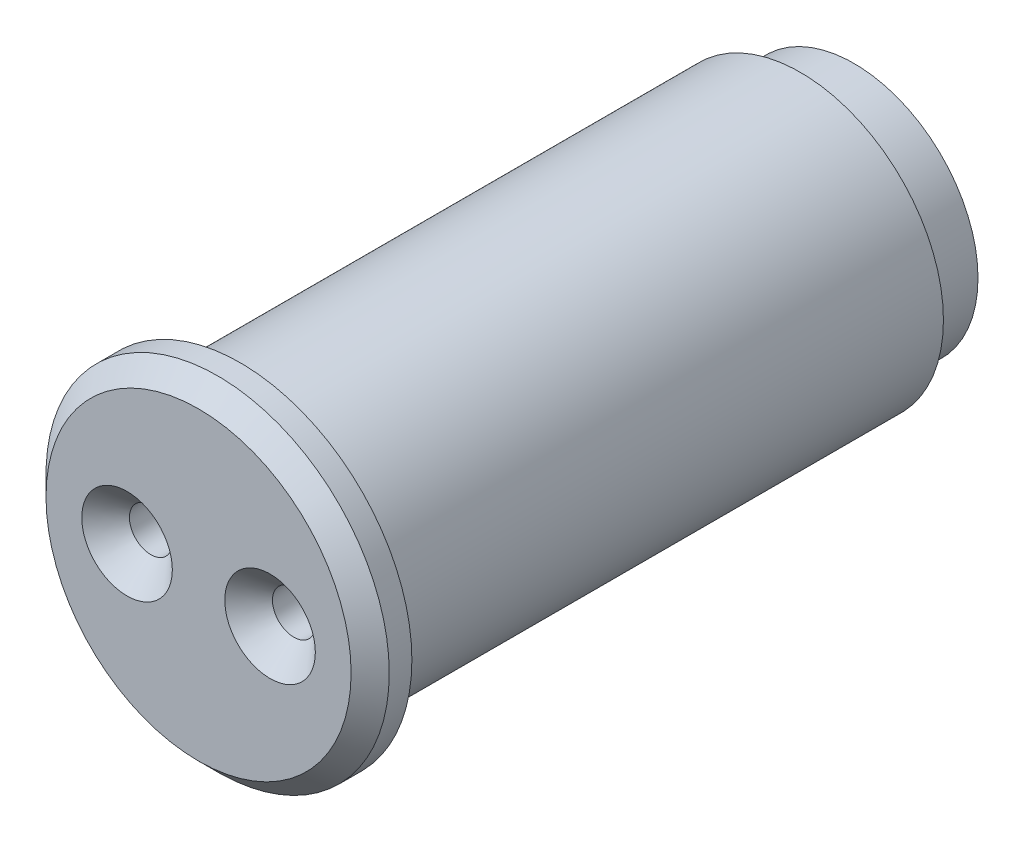
ISO-10303-21;
HEADER;
FILE_DESCRIPTION(('STEP AP214'),'2;1');
FILE_NAME('part.step','',(''),(''),'','','');
FILE_SCHEMA(('AUTOMOTIVE_DESIGN { 1 0 10303 214 1 1 1 1 }'));
ENDSEC;
DATA;
#1=APPLICATION_CONTEXT('core data for automotive mechanical design processes');
#2=APPLICATION_PROTOCOL_DEFINITION('international standard','automotive_design',2000,#1);
#3=PRODUCT_CONTEXT('',#1,'mechanical');
#4=PRODUCT('Part','Part','',(#3));
#5=PRODUCT_RELATED_PRODUCT_CATEGORY('part','',(#4));
#6=PRODUCT_DEFINITION_FORMATION('','',#4);
#7=PRODUCT_DEFINITION_CONTEXT('part definition',#1,'design');
#8=PRODUCT_DEFINITION('design','',#6,#7);
#9=PRODUCT_DEFINITION_SHAPE('','',#8);
#10=(LENGTH_UNIT() NAMED_UNIT(*) SI_UNIT(.MILLI.,.METRE.));
#11=(NAMED_UNIT(*) PLANE_ANGLE_UNIT() SI_UNIT($,.RADIAN.));
#12=(NAMED_UNIT(*) SI_UNIT($,.STERADIAN.) SOLID_ANGLE_UNIT());
#13=UNCERTAINTY_MEASURE_WITH_UNIT(LENGTH_MEASURE(1.E-05),#10,'distance_accuracy_value','');
#14=(GEOMETRIC_REPRESENTATION_CONTEXT(3) GLOBAL_UNCERTAINTY_ASSIGNED_CONTEXT((#13)) GLOBAL_UNIT_ASSIGNED_CONTEXT((#10,
#11,#12)) REPRESENTATION_CONTEXT('',''));
#15=CARTESIAN_POINT('',(0.,0.,0.));
#16=DIRECTION('',(0.,0.,1.));
#17=DIRECTION('',(1.,0.,0.));
#18=AXIS2_PLACEMENT_3D('',#15,#16,#17);
#19=CARTESIAN_POINT('',(0.,0.,25.75));
#20=DIRECTION('',(0.,0.,1.));
#21=DIRECTION('',(1.,0.,0.));
#22=AXIS2_PLACEMENT_3D('',#19,#20,#21);
#23=CYLINDRICAL_SURFACE('',#22,7.2);
#24=CARTESIAN_POINT('',(0.,0.,26.7));
#25=DIRECTION('',(0.,0.,1.));
#26=DIRECTION('',(1.,0.,0.));
#27=AXIS2_PLACEMENT_3D('',#24,#25,#26);
#28=CIRCLE('',#27,7.2);
#29=CARTESIAN_POINT('',(7.2,0.,26.7));
#30=VERTEX_POINT('',#29);
#31=EDGE_CURVE('E10',#30,#30,#28,.F.);
#32=ORIENTED_EDGE('',*,*,#31,.T.);
#33=EDGE_LOOP('',(#32));
#34=FACE_BOUND('',#33,.T.);
#35=CARTESIAN_POINT('',(0.,0.,25.75));
#36=DIRECTION('',(0.,0.,1.));
#37=DIRECTION('',(1.,0.,0.));
#38=AXIS2_PLACEMENT_3D('',#35,#36,#37);
#39=CIRCLE('',#38,7.2);
#40=CARTESIAN_POINT('',(7.2,0.,25.75));
#41=VERTEX_POINT('',#40);
#42=EDGE_CURVE('E76',#41,#41,#39,.T.);
#43=ORIENTED_EDGE('',*,*,#42,.T.);
#44=EDGE_LOOP('',(#43));
#45=FACE_BOUND('',#44,.T.);
#46=ADVANCED_FACE('F33',(#34,#45),#23,.T.);
#47=CARTESIAN_POINT('',(0.,0.,25.75));
#48=DIRECTION('',(0.,0.,1.));
#49=DIRECTION('',(1.,0.,0.));
#50=AXIS2_PLACEMENT_3D('',#47,#48,#49);
#51=PLANE('',#50);
#52=CARTESIAN_POINT('',(0.,0.,25.75));
#53=DIRECTION('',(0.,0.,1.));
#54=DIRECTION('',(1.,0.,0.));
#55=AXIS2_PLACEMENT_3D('',#52,#53,#54);
#56=CIRCLE('',#55,6.);
#57=CARTESIAN_POINT('',(6.,0.,25.75));
#58=VERTEX_POINT('',#57);
#59=EDGE_CURVE('E72',#58,#58,#56,.F.);
#60=ORIENTED_EDGE('',*,*,#59,.F.);
#61=EDGE_LOOP('',(#60));
#62=FACE_BOUND('',#61,.T.);
#63=ORIENTED_EDGE('',*,*,#42,.F.);
#64=EDGE_LOOP('',(#63));
#65=FACE_BOUND('',#64,.T.);
#66=ADVANCED_FACE('F160',(#62,#65),#51,.F.);
#67=CARTESIAN_POINT('',(0.,0.,27.5));
#68=DIRECTION('',(0.,0.,1.));
#69=DIRECTION('',(1.,0.,0.));
#70=AXIS2_PLACEMENT_3D('',#67,#68,#69);
#71=PLANE('',#70);
#72=CARTESIAN_POINT('',(0.,0.,27.5));
#73=DIRECTION('',(0.,0.,1.));
#74=DIRECTION('',(1.,0.,0.));
#75=AXIS2_PLACEMENT_3D('',#72,#73,#74);
#76=CIRCLE('',#75,6.4);
#77=CARTESIAN_POINT('',(6.4,0.,27.5));
#78=VERTEX_POINT('',#77);
#79=EDGE_CURVE('E41',#78,#78,#76,.T.);
#80=ORIENTED_EDGE('',*,*,#79,.T.);
#81=EDGE_LOOP('',(#80));
#82=FACE_BOUND('',#81,.T.);
#83=CARTESIAN_POINT('',(-3.,0.,27.5));
#84=DIRECTION('',(0.,0.,1.));
#85=DIRECTION('',(1.,0.,0.));
#86=AXIS2_PLACEMENT_3D('',#83,#84,#85);
#87=CIRCLE('',#86,1.90000000000001);
#88=CARTESIAN_POINT('',(-1.09999999999999,0.,27.5));
#89=VERTEX_POINT('',#88);
#90=EDGE_CURVE('E49',#89,#89,#87,.F.);
#91=ORIENTED_EDGE('',*,*,#90,.T.);
#92=EDGE_LOOP('',(#91));
#93=FACE_BOUND('',#92,.T.);
#94=CARTESIAN_POINT('',(3.00000000000015,-1.15126107200936E-13,27.5));
#95=DIRECTION('',(0.,0.,1.));
#96=DIRECTION('',(1.,0.,0.));
#97=AXIS2_PLACEMENT_3D('',#94,#95,#96);
#98=CIRCLE('',#97,1.90000000000001);
#99=CARTESIAN_POINT('',(4.90000000000016,-1.15126107200936E-13,27.5));
#100=VERTEX_POINT('',#99);
#101=EDGE_CURVE('E54',#100,#100,#98,.F.);
#102=ORIENTED_EDGE('',*,*,#101,.T.);
#103=EDGE_LOOP('',(#102));
#104=FACE_BOUND('',#103,.T.);
#105=ADVANCED_FACE('F167',(#82,#93,#104),#71,.T.);
#106=CARTESIAN_POINT('',(0.,0.,2.25));
#107=DIRECTION('',(0.,0.,1.));
#108=DIRECTION('',(1.,0.,0.));
#109=AXIS2_PLACEMENT_3D('',#106,#107,#108);
#110=CYLINDRICAL_SURFACE('',#109,6.);
#111=CARTESIAN_POINT('',(0.,0.,2.25));
#112=DIRECTION('',(0.,0.,-1.));
#113=DIRECTION('',(-1.,0.,0.));
#114=AXIS2_PLACEMENT_3D('',#111,#112,#113);
#115=CIRCLE('',#114,6.);
#116=CARTESIAN_POINT('',(-6.,0.,2.25));
#117=VERTEX_POINT('',#116);
#118=EDGE_CURVE('E77',#117,#117,#115,.T.);
#119=ORIENTED_EDGE('',*,*,#118,.F.);
#120=EDGE_LOOP('',(#119));
#121=FACE_BOUND('',#120,.T.);
#122=ORIENTED_EDGE('',*,*,#59,.T.);
#123=EDGE_LOOP('',(#122));
#124=FACE_BOUND('',#123,.T.);
#125=ADVANCED_FACE('F173',(#121,#124),#110,.T.);
#126=CARTESIAN_POINT('',(0.,0.,2.25));
#127=DIRECTION('',(0.,0.,-1.));
#128=DIRECTION('',(-1.,0.,0.));
#129=AXIS2_PLACEMENT_3D('',#126,#127,#128);
#130=PLANE('',#129);
#131=CARTESIAN_POINT('',(0.,0.,2.25));
#132=DIRECTION('',(0.,0.,-1.));
#133=DIRECTION('',(-1.,0.,0.));
#134=AXIS2_PLACEMENT_3D('',#131,#132,#133);
#135=CIRCLE('',#134,5.2);
#136=CARTESIAN_POINT('',(-5.2,0.,2.25));
#137=VERTEX_POINT('',#136);
#138=EDGE_CURVE('E73',#137,#137,#135,.T.);
#139=ORIENTED_EDGE('',*,*,#138,.F.);
#140=EDGE_LOOP('',(#139));
#141=FACE_BOUND('',#140,.T.);
#142=ORIENTED_EDGE('',*,*,#118,.T.);
#143=EDGE_LOOP('',(#142));
#144=FACE_BOUND('',#143,.T.);
#145=ADVANCED_FACE('F137',(#141,#144),#130,.T.);
#146=CARTESIAN_POINT('',(0.,0.,0.));
#147=DIRECTION('',(0.,0.,1.));
#148=DIRECTION('',(1.,0.,0.));
#149=AXIS2_PLACEMENT_3D('',#146,#147,#148);
#150=PLANE('',#149);
#151=CARTESIAN_POINT('',(1.52974878935158,-2.98925118494392,0.));
#152=DIRECTION('',(0.,0.,-1.));
#153=DIRECTION('',(1.,0.,0.));
#154=AXIS2_PLACEMENT_3D('',#151,#152,#153);
#155=CIRCLE('',#154,0.493863848590537);
#156=CARTESIAN_POINT('',(2.02361263794211,-2.98925118494392,0.));
#157=VERTEX_POINT('',#156);
#158=EDGE_CURVE('E106',#157,#157,#155,.T.);
#159=ORIENTED_EDGE('',*,*,#158,.F.);
#160=EDGE_LOOP('',(#159));
#161=FACE_BOUND('',#160,.T.);
#162=CARTESIAN_POINT('',(-1.60059752869924,-2.95192167178147,0.));
#163=DIRECTION('',(0.,0.,-1.));
#164=DIRECTION('',(-1.,0.,0.));
#165=AXIS2_PLACEMENT_3D('',#162,#163,#164);
#166=CIRCLE('',#165,0.493863848590537);
#167=CARTESIAN_POINT('',(-2.09446137728978,-2.95192167178147,0.));
#168=VERTEX_POINT('',#167);
#169=EDGE_CURVE('E112',#168,#168,#166,.T.);
#170=ORIENTED_EDGE('',*,*,#169,.F.);
#171=EDGE_LOOP('',(#170));
#172=FACE_BOUND('',#171,.T.);
#173=CARTESIAN_POINT('',(-1.52974878935158,2.98925118494392,0.));
#174=DIRECTION('',(0.,0.,-1.));
#175=DIRECTION('',(1.,0.,0.));
#176=AXIS2_PLACEMENT_3D('',#173,#174,#175);
#177=CIRCLE('',#176,0.493863848590537);
#178=CARTESIAN_POINT('',(-1.03588494076104,2.98925118494392,0.));
#179=VERTEX_POINT('',#178);
#180=EDGE_CURVE('E118',#179,#179,#177,.T.);
#181=ORIENTED_EDGE('',*,*,#180,.F.);
#182=EDGE_LOOP('',(#181));
#183=FACE_BOUND('',#182,.T.);
#184=CARTESIAN_POINT('',(1.60059752869924,2.95192167178147,0.));
#185=DIRECTION('',(0.,0.,-1.));
#186=DIRECTION('',(-1.,0.,0.));
#187=AXIS2_PLACEMENT_3D('',#184,#185,#186);
#188=CIRCLE('',#187,0.493863848590537);
#189=CARTESIAN_POINT('',(1.1067336801087,2.95192167178147,0.));
#190=VERTEX_POINT('',#189);
#191=EDGE_CURVE('E100',#190,#190,#188,.T.);
#192=ORIENTED_EDGE('',*,*,#191,.F.);
#193=EDGE_LOOP('',(#192));
#194=FACE_BOUND('',#193,.T.);
#195=CARTESIAN_POINT('',(-3.,0.,0.));
#196=DIRECTION('',(0.,0.,1.));
#197=DIRECTION('',(1.,0.,0.));
#198=AXIS2_PLACEMENT_3D('',#195,#196,#197);
#199=CIRCLE('',#198,1.85);
#200=CARTESIAN_POINT('',(-1.15,0.,0.));
#201=VERTEX_POINT('',#200);
#202=EDGE_CURVE('E66',#201,#201,#199,.T.);
#203=ORIENTED_EDGE('',*,*,#202,.T.);
#204=EDGE_LOOP('',(#203));
#205=FACE_BOUND('',#204,.T.);
#206=CARTESIAN_POINT('',(3.00000000000015,-1.15126107200936E-13,0.));
#207=DIRECTION('',(0.,0.,1.));
#208=DIRECTION('',(1.,0.,0.));
#209=AXIS2_PLACEMENT_3D('',#206,#207,#208);
#210=CIRCLE('',#209,1.85);
#211=CARTESIAN_POINT('',(4.85000000000015,-1.15126107200936E-13,0.));
#212=VERTEX_POINT('',#211);
#213=EDGE_CURVE('E69',#212,#212,#210,.T.);
#214=ORIENTED_EDGE('',*,*,#213,.T.);
#215=EDGE_LOOP('',(#214));
#216=FACE_BOUND('',#215,.T.);
#217=CARTESIAN_POINT('',(0.,0.,0.));
#218=DIRECTION('',(0.,0.,1.));
#219=DIRECTION('',(1.,0.,0.));
#220=AXIS2_PLACEMENT_3D('',#217,#218,#219);
#221=CIRCLE('',#220,5.2);
#222=CARTESIAN_POINT('',(5.2,0.,0.));
#223=VERTEX_POINT('',#222);
#224=EDGE_CURVE('E80',#223,#223,#221,.T.);
#225=ORIENTED_EDGE('',*,*,#224,.F.);
#226=EDGE_LOOP('',(#225));
#227=FACE_BOUND('',#226,.T.);
#228=ADVANCED_FACE('F133',(#161,#172,#183,#194,#205,#216,#227),#150,.F.);
#229=CARTESIAN_POINT('',(0.,0.,27.5));
#230=DIRECTION('',(0.,0.,-1.));
#231=DIRECTION('',(-1.,0.,0.));
#232=AXIS2_PLACEMENT_3D('',#229,#230,#231);
#233=CYLINDRICAL_SURFACE('',#232,5.2);
#234=ORIENTED_EDGE('',*,*,#138,.T.);
#235=EDGE_LOOP('',(#234));
#236=FACE_BOUND('',#235,.T.);
#237=ORIENTED_EDGE('',*,*,#224,.T.);
#238=EDGE_LOOP('',(#237));
#239=FACE_BOUND('',#238,.T.);
#240=ADVANCED_FACE('F136',(#236,#239),#233,.T.);
#241=CARTESIAN_POINT('',(3.00000000000015,-1.15126107200936E-13,8.));
#242=DIRECTION('',(0.,0.,-1.));
#243=DIRECTION('',(-1.,0.,0.));
#244=AXIS2_PLACEMENT_3D('',#241,#242,#243);
#245=CYLINDRICAL_SURFACE('',#244,0.85);
#246=CARTESIAN_POINT('',(3.00000000000015,-1.15126107200936E-13,1.));
#247=DIRECTION('',(0.,0.,1.));
#248=DIRECTION('',(1.,0.,0.));
#249=AXIS2_PLACEMENT_3D('',#246,#247,#248);
#250=CIRCLE('',#249,0.85);
#251=CARTESIAN_POINT('',(3.85000000000015,-1.15126107200936E-13,1.));
#252=VERTEX_POINT('',#251);
#253=EDGE_CURVE('E60',#252,#252,#250,.F.);
#254=ORIENTED_EDGE('',*,*,#253,.T.);
#255=EDGE_LOOP('',(#254));
#256=FACE_BOUND('',#255,.T.);
#257=CARTESIAN_POINT('',(3.00000000000015,-1.15126107200936E-13,8.));
#258=DIRECTION('',(0.,0.,1.));
#259=DIRECTION('',(1.,0.,0.));
#260=AXIS2_PLACEMENT_3D('',#257,#258,#259);
#261=CIRCLE('',#260,0.85);
#262=CARTESIAN_POINT('',(3.85000000000015,-1.15126107200936E-13,8.));
#263=VERTEX_POINT('',#262);
#264=EDGE_CURVE('E88',#263,#263,#261,.T.);
#265=ORIENTED_EDGE('',*,*,#264,.T.);
#266=EDGE_LOOP('',(#265));
#267=FACE_BOUND('',#266,.T.);
#268=ADVANCED_FACE('F149',(#256,#267),#245,.F.);
#269=CARTESIAN_POINT('',(3.00000000000015,-1.15126107200936E-13,8.));
#270=DIRECTION('',(0.,0.,-1.));
#271=DIRECTION('',(1.,0.,0.));
#272=AXIS2_PLACEMENT_3D('',#269,#270,#271);
#273=PLANE('',#272);
#274=ORIENTED_EDGE('',*,*,#264,.F.);
#275=EDGE_LOOP('',(#274));
#276=FACE_BOUND('',#275,.T.);
#277=ADVANCED_FACE('F155',(#276),#273,.T.);
#278=CARTESIAN_POINT('',(-3.,0.,8.));
#279=DIRECTION('',(0.,0.,-1.));
#280=DIRECTION('',(-1.,0.,0.));
#281=AXIS2_PLACEMENT_3D('',#278,#279,#280);
#282=CYLINDRICAL_SURFACE('',#281,0.85);
#283=CARTESIAN_POINT('',(-3.,0.,1.));
#284=DIRECTION('',(0.,0.,1.));
#285=DIRECTION('',(1.,0.,0.));
#286=AXIS2_PLACEMENT_3D('',#283,#284,#285);
#287=CIRCLE('',#286,0.85);
#288=CARTESIAN_POINT('',(-2.15,0.,1.));
#289=VERTEX_POINT('',#288);
#290=EDGE_CURVE('E63',#289,#289,#287,.F.);
#291=ORIENTED_EDGE('',*,*,#290,.T.);
#292=EDGE_LOOP('',(#291));
#293=FACE_BOUND('',#292,.T.);
#294=CARTESIAN_POINT('',(-3.,0.,8.));
#295=DIRECTION('',(0.,0.,1.));
#296=DIRECTION('',(1.,0.,0.));
#297=AXIS2_PLACEMENT_3D('',#294,#295,#296);
#298=CIRCLE('',#297,0.85);
#299=CARTESIAN_POINT('',(-2.15,0.,8.));
#300=VERTEX_POINT('',#299);
#301=EDGE_CURVE('E87',#300,#300,#298,.T.);
#302=ORIENTED_EDGE('',*,*,#301,.T.);
#303=EDGE_LOOP('',(#302));
#304=FACE_BOUND('',#303,.T.);
#305=ADVANCED_FACE('F325',(#293,#304),#282,.F.);
#306=CARTESIAN_POINT('',(-3.,0.,8.));
#307=DIRECTION('',(0.,0.,-1.));
#308=DIRECTION('',(1.,0.,0.));
#309=AXIS2_PLACEMENT_3D('',#306,#307,#308);
#310=PLANE('',#309);
#311=ORIENTED_EDGE('',*,*,#301,.F.);
#312=EDGE_LOOP('',(#311));
#313=FACE_BOUND('',#312,.T.);
#314=ADVANCED_FACE('F320',(#313),#310,.T.);
#315=CARTESIAN_POINT('',(-3.,0.,16.9544155877284));
#316=DIRECTION('',(0.,0.,1.));
#317=DIRECTION('',(1.,0.,0.));
#318=AXIS2_PLACEMENT_3D('',#315,#316,#317);
#319=CYLINDRICAL_SURFACE('',#318,0.9);
#320=CARTESIAN_POINT('',(-3.,0.,26.5));
#321=DIRECTION('',(0.,0.,1.));
#322=DIRECTION('',(1.,0.,0.));
#323=AXIS2_PLACEMENT_3D('',#320,#321,#322);
#324=CIRCLE('',#323,0.9);
#325=CARTESIAN_POINT('',(-2.1,0.,26.5));
#326=VERTEX_POINT('',#325);
#327=EDGE_CURVE('E57',#326,#326,#324,.T.);
#328=ORIENTED_EDGE('',*,*,#327,.T.);
#329=EDGE_LOOP('',(#328));
#330=FACE_BOUND('',#329,.T.);
#331=CARTESIAN_POINT('',(-3.,0.,19.5));
#332=DIRECTION('',(0.,0.,1.));
#333=DIRECTION('',(1.,0.,0.));
#334=AXIS2_PLACEMENT_3D('',#331,#332,#333);
#335=CIRCLE('',#334,0.9);
#336=CARTESIAN_POINT('',(-2.1,0.,19.5));
#337=VERTEX_POINT('',#336);
#338=EDGE_CURVE('E91',#337,#337,#335,.F.);
#339=ORIENTED_EDGE('',*,*,#338,.T.);
#340=EDGE_LOOP('',(#339));
#341=FACE_BOUND('',#340,.T.);
#342=ADVANCED_FACE('F195',(#330,#341),#319,.F.);
#343=CARTESIAN_POINT('',(3.00000000000015,-1.15126107200936E-13,16.9544155877284));
#344=DIRECTION('',(0.,0.,1.));
#345=DIRECTION('',(1.,0.,0.));
#346=AXIS2_PLACEMENT_3D('',#343,#344,#345);
#347=CYLINDRICAL_SURFACE('',#346,0.9);
#348=CARTESIAN_POINT('',(3.00000000000015,-1.15126107200936E-13,26.5));
#349=DIRECTION('',(0.,0.,1.));
#350=DIRECTION('',(1.,0.,0.));
#351=AXIS2_PLACEMENT_3D('',#348,#349,#350);
#352=CIRCLE('',#351,0.9);
#353=CARTESIAN_POINT('',(3.90000000000015,-1.15126107200936E-13,26.5));
#354=VERTEX_POINT('',#353);
#355=EDGE_CURVE('E45',#354,#354,#352,.T.);
#356=ORIENTED_EDGE('',*,*,#355,.T.);
#357=EDGE_LOOP('',(#356));
#358=FACE_BOUND('',#357,.T.);
#359=CARTESIAN_POINT('',(3.00000000000015,-1.15126107200936E-13,19.5));
#360=DIRECTION('',(0.,0.,1.));
#361=DIRECTION('',(1.,0.,0.));
#362=AXIS2_PLACEMENT_3D('',#359,#360,#361);
#363=CIRCLE('',#362,0.9);
#364=CARTESIAN_POINT('',(3.90000000000015,-1.15126107200936E-13,19.5));
#365=VERTEX_POINT('',#364);
#366=EDGE_CURVE('E94',#365,#365,#363,.F.);
#367=ORIENTED_EDGE('',*,*,#366,.T.);
#368=EDGE_LOOP('',(#367));
#369=FACE_BOUND('',#368,.T.);
#370=ADVANCED_FACE('F191',(#358,#369),#347,.F.);
#371=CARTESIAN_POINT('',(-3.,0.,19.5));
#372=DIRECTION('',(0.,0.,1.));
#373=DIRECTION('',(1.,0.,0.));
#374=AXIS2_PLACEMENT_3D('',#371,#372,#373);
#375=PLANE('',#374);
#376=ORIENTED_EDGE('',*,*,#338,.F.);
#377=EDGE_LOOP('',(#376));
#378=FACE_BOUND('',#377,.T.);
#379=ADVANCED_FACE('F194',(#378),#375,.T.);
#380=CARTESIAN_POINT('',(3.00000000000015,-1.15126107200936E-13,19.5));
#381=DIRECTION('',(0.,0.,1.));
#382=DIRECTION('',(1.,0.,0.));
#383=AXIS2_PLACEMENT_3D('',#380,#381,#382);
#384=PLANE('',#383);
#385=ORIENTED_EDGE('',*,*,#366,.F.);
#386=EDGE_LOOP('',(#385));
#387=FACE_BOUND('',#386,.T.);
#388=ADVANCED_FACE('F199',(#387),#384,.T.);
#389=CARTESIAN_POINT('',(-3.,0.,0.));
#390=DIRECTION('',(0.,0.,-1.));
#391=DIRECTION('',(-1.,0.,0.));
#392=AXIS2_PLACEMENT_3D('',#389,#390,#391);
#393=CONICAL_SURFACE('',#392,1.85,0.785398163397447);
#394=ORIENTED_EDGE('',*,*,#290,.F.);
#395=EDGE_LOOP('',(#394));
#396=FACE_BOUND('',#395,.T.);
#397=ORIENTED_EDGE('',*,*,#202,.F.);
#398=EDGE_LOOP('',(#397));
#399=FACE_BOUND('',#398,.T.);
#400=ADVANCED_FACE('F201',(#396,#399),#393,.F.);
#401=CARTESIAN_POINT('',(3.00000000000015,-1.15126107200936E-13,0.));
#402=DIRECTION('',(0.,0.,-1.));
#403=DIRECTION('',(-1.,0.,0.));
#404=AXIS2_PLACEMENT_3D('',#401,#402,#403);
#405=CONICAL_SURFACE('',#404,1.85,0.785398163397447);
#406=ORIENTED_EDGE('',*,*,#253,.F.);
#407=EDGE_LOOP('',(#406));
#408=FACE_BOUND('',#407,.T.);
#409=ORIENTED_EDGE('',*,*,#213,.F.);
#410=EDGE_LOOP('',(#409));
#411=FACE_BOUND('',#410,.T.);
#412=ADVANCED_FACE('F207',(#408,#411),#405,.F.);
#413=CARTESIAN_POINT('',(-3.,0.,26.5));
#414=DIRECTION('',(0.,0.,1.));
#415=DIRECTION('',(1.,0.,0.));
#416=AXIS2_PLACEMENT_3D('',#413,#414,#415);
#417=CONICAL_SURFACE('',#416,0.9,0.785398163397451);
#418=ORIENTED_EDGE('',*,*,#90,.F.);
#419=EDGE_LOOP('',(#418));
#420=FACE_BOUND('',#419,.T.);
#421=ORIENTED_EDGE('',*,*,#327,.F.);
#422=EDGE_LOOP('',(#421));
#423=FACE_BOUND('',#422,.T.);
#424=ADVANCED_FACE('F188',(#420,#423),#417,.F.);
#425=CARTESIAN_POINT('',(3.00000000000015,-1.15126107200936E-13,26.5));
#426=DIRECTION('',(0.,0.,1.));
#427=DIRECTION('',(1.,0.,0.));
#428=AXIS2_PLACEMENT_3D('',#425,#426,#427);
#429=CONICAL_SURFACE('',#428,0.9,0.785398163397451);
#430=ORIENTED_EDGE('',*,*,#101,.F.);
#431=EDGE_LOOP('',(#430));
#432=FACE_BOUND('',#431,.T.);
#433=ORIENTED_EDGE('',*,*,#355,.F.);
#434=EDGE_LOOP('',(#433));
#435=FACE_BOUND('',#434,.T.);
#436=ADVANCED_FACE('F184',(#432,#435),#429,.F.);
#437=CARTESIAN_POINT('',(1.60059752869924,2.95192167178147,1.));
#438=DIRECTION('',(0.,0.,-1.));
#439=DIRECTION('',(-1.,0.,0.));
#440=AXIS2_PLACEMENT_3D('',#437,#438,#439);
#441=CYLINDRICAL_SURFACE('',#440,0.493863848590537);
#442=CARTESIAN_POINT('',(1.60059752869924,2.95192167178147,1.));
#443=DIRECTION('',(0.,0.,-1.));
#444=DIRECTION('',(-1.,0.,0.));
#445=AXIS2_PLACEMENT_3D('',#442,#443,#444);
#446=CIRCLE('',#445,0.493863848590537);
#447=CARTESIAN_POINT('',(1.1067336801087,2.95192167178147,1.));
#448=VERTEX_POINT('',#447);
#449=EDGE_CURVE('E97',#448,#448,#446,.T.);
#450=ORIENTED_EDGE('',*,*,#449,.F.);
#451=EDGE_LOOP('',(#450));
#452=FACE_BOUND('',#451,.T.);
#453=ORIENTED_EDGE('',*,*,#191,.T.);
#454=EDGE_LOOP('',(#453));
#455=FACE_BOUND('',#454,.T.);
#456=ADVANCED_FACE('F187',(#452,#455),#441,.F.);
#457=CARTESIAN_POINT('',(1.60059752869924,2.95192167178147,1.));
#458=DIRECTION('',(0.,0.,-1.));
#459=DIRECTION('',(-1.,0.,0.));
#460=AXIS2_PLACEMENT_3D('',#457,#458,#459);
#461=PLANE('',#460);
#462=ORIENTED_EDGE('',*,*,#449,.T.);
#463=EDGE_LOOP('',(#462));
#464=FACE_BOUND('',#463,.T.);
#465=ADVANCED_FACE('F129',(#464),#461,.T.);
#466=CARTESIAN_POINT('',(-1.52974878935158,2.98925118494392,1.));
#467=DIRECTION('',(0.,0.,-1.));
#468=DIRECTION('',(-1.,0.,0.));
#469=AXIS2_PLACEMENT_3D('',#466,#467,#468);
#470=CYLINDRICAL_SURFACE('',#469,0.493863848590537);
#471=CARTESIAN_POINT('',(-1.52974878935158,2.98925118494392,1.));
#472=DIRECTION('',(0.,0.,-1.));
#473=DIRECTION('',(1.,0.,0.));
#474=AXIS2_PLACEMENT_3D('',#471,#472,#473);
#475=CIRCLE('',#474,0.493863848590537);
#476=CARTESIAN_POINT('',(-1.03588494076104,2.98925118494392,1.));
#477=VERTEX_POINT('',#476);
#478=EDGE_CURVE('E103',#477,#477,#475,.T.);
#479=ORIENTED_EDGE('',*,*,#478,.F.);
#480=EDGE_LOOP('',(#479));
#481=FACE_BOUND('',#480,.T.);
#482=ORIENTED_EDGE('',*,*,#180,.T.);
#483=EDGE_LOOP('',(#482));
#484=FACE_BOUND('',#483,.T.);
#485=ADVANCED_FACE('F126',(#481,#484),#470,.F.);
#486=CARTESIAN_POINT('',(-1.52974878935158,2.98925118494392,1.));
#487=DIRECTION('',(0.,0.,1.));
#488=DIRECTION('',(1.,0.,0.));
#489=AXIS2_PLACEMENT_3D('',#486,#487,#488);
#490=PLANE('',#489);
#491=ORIENTED_EDGE('',*,*,#478,.T.);
#492=EDGE_LOOP('',(#491));
#493=FACE_BOUND('',#492,.T.);
#494=ADVANCED_FACE('F124',(#493),#490,.F.);
#495=CARTESIAN_POINT('',(-1.60059752869924,-2.95192167178147,1.));
#496=DIRECTION('',(0.,0.,-1.));
#497=DIRECTION('',(-1.,0.,0.));
#498=AXIS2_PLACEMENT_3D('',#495,#496,#497);
#499=CYLINDRICAL_SURFACE('',#498,0.493863848590537);
#500=CARTESIAN_POINT('',(-1.60059752869924,-2.95192167178147,1.));
#501=DIRECTION('',(0.,0.,-1.));
#502=DIRECTION('',(-1.,0.,0.));
#503=AXIS2_PLACEMENT_3D('',#500,#501,#502);
#504=CIRCLE('',#503,0.493863848590537);
#505=CARTESIAN_POINT('',(-2.09446137728978,-2.95192167178147,1.));
#506=VERTEX_POINT('',#505);
#507=EDGE_CURVE('E115',#506,#506,#504,.T.);
#508=ORIENTED_EDGE('',*,*,#507,.F.);
#509=EDGE_LOOP('',(#508));
#510=FACE_BOUND('',#509,.T.);
#511=ORIENTED_EDGE('',*,*,#169,.T.);
#512=EDGE_LOOP('',(#511));
#513=FACE_BOUND('',#512,.T.);
#514=ADVANCED_FACE('F268',(#510,#513),#499,.F.);
#515=CARTESIAN_POINT('',(-1.60059752869924,-2.95192167178147,1.));
#516=DIRECTION('',(0.,0.,-1.));
#517=DIRECTION('',(-1.,0.,0.));
#518=AXIS2_PLACEMENT_3D('',#515,#516,#517);
#519=PLANE('',#518);
#520=ORIENTED_EDGE('',*,*,#507,.T.);
#521=EDGE_LOOP('',(#520));
#522=FACE_BOUND('',#521,.T.);
#523=ADVANCED_FACE('F277',(#522),#519,.T.);
#524=CARTESIAN_POINT('',(1.52974878935158,-2.98925118494392,1.));
#525=DIRECTION('',(0.,0.,-1.));
#526=DIRECTION('',(-1.,0.,0.));
#527=AXIS2_PLACEMENT_3D('',#524,#525,#526);
#528=CYLINDRICAL_SURFACE('',#527,0.493863848590537);
#529=CARTESIAN_POINT('',(1.52974878935158,-2.98925118494392,1.));
#530=DIRECTION('',(0.,0.,-1.));
#531=DIRECTION('',(1.,0.,0.));
#532=AXIS2_PLACEMENT_3D('',#529,#530,#531);
#533=CIRCLE('',#532,0.493863848590537);
#534=CARTESIAN_POINT('',(2.02361263794211,-2.98925118494392,1.));
#535=VERTEX_POINT('',#534);
#536=EDGE_CURVE('E109',#535,#535,#533,.T.);
#537=ORIENTED_EDGE('',*,*,#536,.F.);
#538=EDGE_LOOP('',(#537));
#539=FACE_BOUND('',#538,.T.);
#540=ORIENTED_EDGE('',*,*,#158,.T.);
#541=EDGE_LOOP('',(#540));
#542=FACE_BOUND('',#541,.T.);
#543=ADVANCED_FACE('F287',(#539,#542),#528,.F.);
#544=CARTESIAN_POINT('',(1.52974878935158,-2.98925118494392,1.));
#545=DIRECTION('',(0.,0.,1.));
#546=DIRECTION('',(1.,0.,0.));
#547=AXIS2_PLACEMENT_3D('',#544,#545,#546);
#548=PLANE('',#547);
#549=ORIENTED_EDGE('',*,*,#536,.T.);
#550=EDGE_LOOP('',(#549));
#551=FACE_BOUND('',#550,.T.);
#552=ADVANCED_FACE('F296',(#551),#548,.F.);
#553=CARTESIAN_POINT('',(0.,0.,27.5));
#554=DIRECTION('',(0.,0.,-1.));
#555=DIRECTION('',(-1.,0.,0.));
#556=AXIS2_PLACEMENT_3D('',#553,#554,#555);
#557=CONICAL_SURFACE('',#556,6.4,0.785398163397443);
#558=ORIENTED_EDGE('',*,*,#31,.F.);
#559=EDGE_LOOP('',(#558));
#560=FACE_BOUND('',#559,.T.);
#561=ORIENTED_EDGE('',*,*,#79,.F.);
#562=EDGE_LOOP('',(#561));
#563=FACE_BOUND('',#562,.T.);
#564=ADVANCED_FACE('F36',(#560,#563),#557,.T.);
#565=CLOSED_SHELL('',(#46,#66,#105,#125,#145,#228,#240,#268,#277,#305,#314,#342,#370,#379,#388,
#400,#412,#424,#436,#456,#465,#485,#494,#514,#523,#543,#552,#564));
#566=MANIFOLD_SOLID_BREP('B2',#565);
#567=ADVANCED_BREP_SHAPE_REPRESENTATION('',(#18,#566),#14);
#568=SHAPE_DEFINITION_REPRESENTATION(#9,#567);
ENDSEC;
END-ISO-10303-21;
